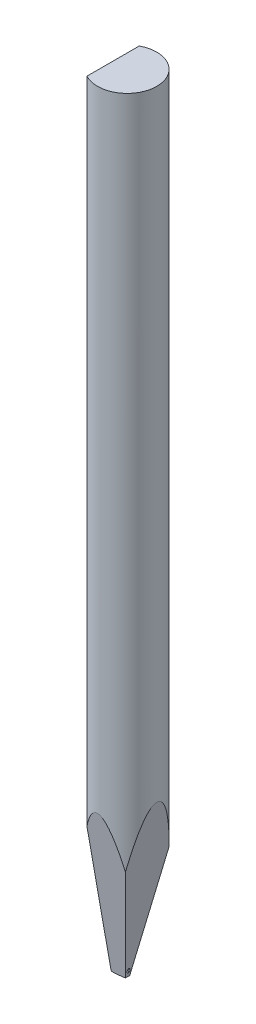
ISO-10303-21;
HEADER;
FILE_DESCRIPTION(('STEP AP214'),'2;1');
FILE_NAME('part.step','',(''),(''),'','','');
FILE_SCHEMA(('AUTOMOTIVE_DESIGN { 1 0 10303 214 1 1 1 1 }'));
ENDSEC;
DATA;
#1=APPLICATION_CONTEXT('core data for automotive mechanical design processes');
#2=APPLICATION_PROTOCOL_DEFINITION('international standard','automotive_design',2000,#1);
#3=PRODUCT_CONTEXT('',#1,'mechanical');
#4=PRODUCT('Part','Part','',(#3));
#5=PRODUCT_RELATED_PRODUCT_CATEGORY('part','',(#4));
#6=PRODUCT_DEFINITION_FORMATION('','',#4);
#7=PRODUCT_DEFINITION_CONTEXT('part definition',#1,'design');
#8=PRODUCT_DEFINITION('design','',#6,#7);
#9=PRODUCT_DEFINITION_SHAPE('','',#8);
#10=(LENGTH_UNIT() NAMED_UNIT(*) SI_UNIT(.MILLI.,.METRE.));
#11=(NAMED_UNIT(*) PLANE_ANGLE_UNIT() SI_UNIT($,.RADIAN.));
#12=(NAMED_UNIT(*) SI_UNIT($,.STERADIAN.) SOLID_ANGLE_UNIT());
#13=UNCERTAINTY_MEASURE_WITH_UNIT(LENGTH_MEASURE(1.E-05),#10,'distance_accuracy_value','');
#14=(GEOMETRIC_REPRESENTATION_CONTEXT(3) GLOBAL_UNCERTAINTY_ASSIGNED_CONTEXT((#13)) GLOBAL_UNIT_ASSIGNED_CONTEXT((#10,
#11,#12)) REPRESENTATION_CONTEXT('',''));
#15=CARTESIAN_POINT('',(0.,0.,0.));
#16=DIRECTION('',(0.,0.,1.));
#17=DIRECTION('',(1.,0.,0.));
#18=AXIS2_PLACEMENT_3D('',#15,#16,#17);
#19=CARTESIAN_POINT('',(26.8738719491216,0.,0.0508));
#20=DIRECTION('',(0.,-0.173648177666931,0.984807753012208));
#21=DIRECTION('',(0.,-0.984807753012208,-0.173648177666931));
#22=AXIS2_PLACEMENT_3D('',#19,#20,#21);
#23=PLANE('',#22);
#24=CARTESIAN_POINT('',(-0.35052,0.0254,0.0552787053099968));
#25=DIRECTION('',(0.,-0.173648177666931,0.984807753012208));
#26=DIRECTION('',(0.,-0.984807753012208,-0.173648177666931));
#27=AXIS2_PLACEMENT_3D('',#24,#25,#26);
#28=ELLIPSE('',#27,0.0257918359418979,0.0254);
#29=CARTESIAN_POINT('',(-0.35052,0.,0.0508000000000018));
#30=VERTEX_POINT('',#29);
#31=CARTESIAN_POINT('',(-0.37592,0.0254,0.0552787053099968));
#32=VERTEX_POINT('',#31);
#33=EDGE_CURVE('E198',#30,#32,#28,.F.);
#34=ORIENTED_EDGE('',*,*,#33,.F.);
#35=DIRECTION('',(-1.,0.,0.));
#36=VECTOR('',#35,1.);
#37=CARTESIAN_POINT('',(26.8738719491216,0.,0.0508));
#38=LINE('',#37,#36);
#39=CARTESIAN_POINT('',(-0.248920000000001,0.,0.0508000000000001));
#40=VERTEX_POINT('',#39);
#41=EDGE_CURVE('E258',#40,#30,#38,.T.);
#42=ORIENTED_EDGE('',*,*,#41,.F.);
#43=DIRECTION('',(-0.98997002855162,-0.139131214142995,-0.0245325869121374));
#44=VECTOR('',#43,1.);
#45=CARTESIAN_POINT('',(26.3325188531676,3.73577760401477,0.709518385514232));
#46=LINE('',#45,#44);
#47=CARTESIAN_POINT('',(0.0115343561363234,0.0366044726132731,0.0572543561363242));
#48=VERTEX_POINT('',#47);
#49=EDGE_CURVE('E255',#48,#40,#46,.T.);
#50=ORIENTED_EDGE('',*,*,#49,.F.);
#51=DIRECTION('',(-0.171087869746036,-0.970287525247814,-0.171087869746036));
#52=VECTOR('',#51,1.);
#53=CARTESIAN_POINT('',(0.791557999082988,4.46033837772866,0.837277999082991));
#54=LINE('',#53,#52);
#55=CARTESIAN_POINT('',(0.537041505266772,3.01690361355591,0.582761505266774));
#56=VERTEX_POINT('',#55);
#57=EDGE_CURVE('E252',#56,#48,#54,.T.);
#58=ORIENTED_EDGE('',*,*,#57,.F.);
#59=CARTESIAN_POINT('',(0.,-0.288101116436578,0.));
#60=DIRECTION('',(0.,-0.173648177666931,0.984807753012208));
#61=DIRECTION('',(0.,-0.984807753012208,-0.173648177666931));
#62=AXIS2_PLACEMENT_3D('',#59,#60,#61);
#63=ELLIPSE('',#62,4.56371043248163,0.792479999999998);
#64=CARTESIAN_POINT('',(-0.37592,3.66844093071415,0.69764511322018));
#65=VERTEX_POINT('',#64);
#66=EDGE_CURVE('E263',#56,#65,#63,.T.);
#67=ORIENTED_EDGE('',*,*,#66,.T.);
#68=DIRECTION('',(0.,0.984807753012208,0.173648177666931));
#69=VECTOR('',#68,1.);
#70=CARTESIAN_POINT('',(-0.37592,20.251112252608,3.62161747949059));
#71=LINE('',#70,#69);
#72=EDGE_CURVE('E277',#32,#65,#71,.T.);
#73=ORIENTED_EDGE('',*,*,#72,.F.);
#74=EDGE_LOOP('',(#34,#42,#50,#58,#67,#73));
#75=FACE_BOUND('',#74,.T.);
#76=ADVANCED_FACE('F46',(#75),#23,.T.);
#77=CARTESIAN_POINT('',(26.8738719491216,0.,-0.0508));
#78=DIRECTION('',(0.,-0.173648177666931,-0.984807753012208));
#79=DIRECTION('',(0.,0.984807753012208,-0.173648177666931));
#80=AXIS2_PLACEMENT_3D('',#77,#78,#79);
#81=PLANE('',#80);
#82=CARTESIAN_POINT('',(-0.35052,0.0254,-0.0552787053099968));
#83=DIRECTION('',(0.,-0.173648177666931,-0.984807753012208));
#84=DIRECTION('',(0.,0.984807753012208,-0.173648177666931));
#85=AXIS2_PLACEMENT_3D('',#82,#83,#84);
#86=ELLIPSE('',#85,0.0257918359418979,0.0254);
#87=CARTESIAN_POINT('',(-0.37592,0.0254,-0.0552787053099968));
#88=VERTEX_POINT('',#87);
#89=CARTESIAN_POINT('',(-0.35052,0.,-0.0508000000000018));
#90=VERTEX_POINT('',#89);
#91=EDGE_CURVE('E195',#88,#90,#86,.F.);
#92=ORIENTED_EDGE('',*,*,#91,.F.);
#93=DIRECTION('',(0.,-0.984807753012208,0.173648177666931));
#94=VECTOR('',#93,1.);
#95=CARTESIAN_POINT('',(-0.37592,20.5255765703836,-3.67001294395617));
#96=LINE('',#95,#94);
#97=CARTESIAN_POINT('',(-0.37592,3.66844093071414,-0.69764511322018));
#98=VERTEX_POINT('',#97);
#99=EDGE_CURVE('E187',#98,#88,#96,.T.);
#100=ORIENTED_EDGE('',*,*,#99,.F.);
#101=CARTESIAN_POINT('',(0.,-0.288101116436578,0.));
#102=DIRECTION('',(0.,-0.173648177666931,-0.984807753012208));
#103=DIRECTION('',(0.,-0.984807753012208,0.173648177666931));
#104=AXIS2_PLACEMENT_3D('',#101,#102,#103);
#105=ELLIPSE('',#104,4.56371043248163,0.792479999999998);
#106=CARTESIAN_POINT('',(0.537041505266772,3.01690361355591,-0.582761505266774));
#107=VERTEX_POINT('',#106);
#108=EDGE_CURVE('E266',#98,#107,#105,.T.);
#109=ORIENTED_EDGE('',*,*,#108,.T.);
#110=DIRECTION('',(0.171087869746036,0.970287525247814,-0.171087869746036));
#111=VECTOR('',#110,1.);
#112=CARTESIAN_POINT('',(0.791557999082988,4.46033837772866,-0.837277999082991));
#113=LINE('',#112,#111);
#114=CARTESIAN_POINT('',(0.0115343561363234,0.0366044726132731,-0.0572543561363242));
#115=VERTEX_POINT('',#114);
#116=EDGE_CURVE('E280',#115,#107,#113,.T.);
#117=ORIENTED_EDGE('',*,*,#116,.F.);
#118=DIRECTION('',(0.98997002855162,0.139131214142995,-0.0245325869121374));
#119=VECTOR('',#118,1.);
#120=CARTESIAN_POINT('',(26.3325188531676,3.73577760401477,-0.709518385514232));
#121=LINE('',#120,#119);
#122=CARTESIAN_POINT('',(-0.248920000000001,0.,-0.0508000000000001));
#123=VERTEX_POINT('',#122);
#124=EDGE_CURVE('E283',#123,#115,#121,.T.);
#125=ORIENTED_EDGE('',*,*,#124,.F.);
#126=DIRECTION('',(-1.,0.,0.));
#127=VECTOR('',#126,1.);
#128=CARTESIAN_POINT('',(26.8738719491216,0.,-0.0508));
#129=LINE('',#128,#127);
#130=EDGE_CURVE('E260',#123,#90,#129,.T.);
#131=ORIENTED_EDGE('',*,*,#130,.T.);
#132=EDGE_LOOP('',(#92,#100,#109,#117,#125,#131));
#133=FACE_BOUND('',#132,.T.);
#134=ADVANCED_FACE('F372',(#133),#81,.T.);
#135=CARTESIAN_POINT('',(-0.24892,0.,27.2760283406468));
#136=DIRECTION('',(-0.139173100960066,0.99026806874157,0.));
#137=DIRECTION('',(-0.99026806874157,-0.139173100960066,0.));
#138=AXIS2_PLACEMENT_3D('',#135,#136,#137);
#139=PLANE('',#138);
#140=DIRECTION('',(-0.99026806874157,-0.139173100960066,0.));
#141=VECTOR('',#140,1.);
#142=CARTESIAN_POINT('',(-0.24892,0.,0.0253999999999983));
#143=LINE('',#142,#141);
#144=CARTESIAN_POINT('',(-0.127,0.0171347385669156,0.0253999999999992));
#145=VERTEX_POINT('',#144);
#146=CARTESIAN_POINT('',(-0.229291435266472,0.00275861487165988,0.0254));
#147=VERTEX_POINT('',#146);
#148=EDGE_CURVE('E238',#145,#147,#143,.T.);
#149=ORIENTED_EDGE('',*,*,#148,.F.);
#150=DIRECTION('',(0.,0.,1.));
#151=VECTOR('',#150,1.);
#152=CARTESIAN_POINT('',(-0.127,0.0171347385669156,27.2760283406468));
#153=LINE('',#152,#151);
#154=CARTESIAN_POINT('',(-0.127,0.0171347385669156,-0.0253999999999992));
#155=VERTEX_POINT('',#154);
#156=EDGE_CURVE('E294',#155,#145,#153,.T.);
#157=ORIENTED_EDGE('',*,*,#156,.F.);
#158=DIRECTION('',(-0.99026806874157,-0.139173100960066,0.));
#159=VECTOR('',#158,1.);
#160=CARTESIAN_POINT('',(-0.24892,0.,-0.0253999999999983));
#161=LINE('',#160,#159);
#162=CARTESIAN_POINT('',(-0.229291435266472,0.00275861487165988,-0.0254));
#163=VERTEX_POINT('',#162);
#164=EDGE_CURVE('E234',#155,#163,#161,.T.);
#165=ORIENTED_EDGE('',*,*,#164,.T.);
#166=CARTESIAN_POINT('',(-2.40864817183527,-0.30353,0.));
#167=DIRECTION('',(-0.139173100960066,0.99026806874157,0.));
#168=DIRECTION('',(-0.99026806874157,-0.139173100960066,0.));
#169=AXIS2_PLACEMENT_3D('',#166,#167,#168);
#170=ELLIPSE('',#169,2.20832903686027,0.30734);
#171=CARTESIAN_POINT('',(-0.24892,0.,-0.0482432865795794));
#172=VERTEX_POINT('',#171);
#173=EDGE_CURVE('E286',#163,#172,#170,.T.);
#174=ORIENTED_EDGE('',*,*,#173,.T.);
#175=DIRECTION('',(0.,0.,-1.));
#176=VECTOR('',#175,1.);
#177=CARTESIAN_POINT('',(-0.24892,0.,27.2760283406468));
#178=LINE('',#177,#176);
#179=EDGE_CURVE('E244',#172,#123,#178,.T.);
#180=ORIENTED_EDGE('',*,*,#179,.T.);
#181=ORIENTED_EDGE('',*,*,#124,.T.);
#182=DIRECTION('',(0.,0.,-1.));
#183=VECTOR('',#182,1.);
#184=CARTESIAN_POINT('',(0.0115343561363241,0.036604472613273,27.2760283406468));
#185=LINE('',#184,#183);
#186=EDGE_CURVE('E241',#48,#115,#185,.T.);
#187=ORIENTED_EDGE('',*,*,#186,.F.);
#188=ORIENTED_EDGE('',*,*,#49,.T.);
#189=CARTESIAN_POINT('',(-0.24892,0.,0.0482432865795852));
#190=VERTEX_POINT('',#189);
#191=EDGE_CURVE('E246',#40,#190,#178,.T.);
#192=ORIENTED_EDGE('',*,*,#191,.T.);
#193=EDGE_CURVE('E287',#190,#147,#170,.T.);
#194=ORIENTED_EDGE('',*,*,#193,.T.);
#195=EDGE_LOOP('',(#149,#157,#165,#174,#180,#181,#187,#188,#192,#194));
#196=FACE_BOUND('',#195,.T.);
#197=ADVANCED_FACE('F319',(#196),#139,.F.);
#198=CARTESIAN_POINT('',(26.7151219491216,-0.30353,0.));
#199=DIRECTION('',(-1.,0.,0.));
#200=DIRECTION('',(0.,0.,1.));
#201=AXIS2_PLACEMENT_3D('',#198,#199,#200);
#202=CYLINDRICAL_SURFACE('',#201,0.30734);
#203=DIRECTION('',(-1.,0.,0.));
#204=VECTOR('',#203,1.);
#205=CARTESIAN_POINT('',(26.7151219491216,0.,0.0482432865795852));
#206=LINE('',#205,#204);
#207=CARTESIAN_POINT('',(-0.35052,0.,0.0482432865795858));
#208=VERTEX_POINT('',#207);
#209=EDGE_CURVE('E293',#190,#208,#206,.T.);
#210=ORIENTED_EDGE('',*,*,#209,.T.);
#211=CARTESIAN_POINT('',(-0.35052,0.,0.0482432865795852));
#212=CARTESIAN_POINT('',(-0.350767913301096,-1.19542843772803E-07,0.0482439866555444));
#213=CARTESIAN_POINT('',(-0.351014861392933,3.62470794984307E-06,0.0482204837583812));
#214=CARTESIAN_POINT('',(-0.351497824475882,1.77257610530701E-05,0.048131663550789));
#215=CARTESIAN_POINT('',(-0.351733938449228,2.79980345508259E-05,0.0480668807295799));
#216=CARTESIAN_POINT('',(-0.352256326088675,5.77005969758154E-05,0.0478789541586123));
#217=CARTESIAN_POINT('',(-0.352538394385228,7.88787351782238E-05,0.0477446199469163));
#218=CARTESIAN_POINT('',(-0.353078295346921,0.000127703558985932,0.0474331108524059));
#219=CARTESIAN_POINT('',(-0.353335984553503,0.000155385552449527,0.0472557019452807));
#220=CARTESIAN_POINT('',(-0.35400174233734,0.00023617459435752,0.0467343071530912));
#221=CARTESIAN_POINT('',(-0.354386489991853,0.000293366747035686,0.04636155839518));
#222=CARTESIAN_POINT('',(-0.355098951579075,0.000413574680164901,0.0455669319559007));
#223=CARTESIAN_POINT('',(-0.355426537167256,0.000476603091413842,0.0451449471799639));
#224=CARTESIAN_POINT('',(-0.356612086855196,0.000724574718518854,0.0434579803018295));
#225=CARTESIAN_POINT('',(-0.357318341338528,0.000917424822642028,0.0420900984298448));
#226=CARTESIAN_POINT('',(-0.358546499103955,0.00129385703696121,0.0392733364497388));
#227=CARTESIAN_POINT('',(-0.359067131306756,0.0014773681362723,0.0378239736931028));
#228=CARTESIAN_POINT('',(-0.361082963556255,0.00223677886764504,0.0314441024489423));
#229=CARTESIAN_POINT('',(-0.361998491462294,0.00272303861932352,0.0263250556700738));
#230=CARTESIAN_POINT('',(-0.363287466260708,0.00343648568054079,0.0160225561821279));
#231=CARTESIAN_POINT('',(-0.363659578270333,0.0036630347273081,0.0108389763129056));
#232=CARTESIAN_POINT('',(-0.363972985043323,0.00385330138614358,0.000449493392470492));
#233=CARTESIAN_POINT('',(-0.363914353724792,0.00381706409391508,-0.00475640567539981));
#234=CARTESIAN_POINT('',(-0.363359645903479,0.00348101396992523,-0.0151346555748545));
#235=CARTESIAN_POINT('',(-0.362863906204434,0.00318140407436096,-0.0203070291482792));
#236=CARTESIAN_POINT('',(-0.361587863461915,0.00253284401461739,-0.0281196828661227));
#237=CARTESIAN_POINT('',(-0.361052170464876,0.0022738659867185,-0.0308032472057407));
#238=CARTESIAN_POINT('',(-0.359879874536839,0.00178202258087802,-0.0352985409759539));
#239=CARTESIAN_POINT('',(-0.359320212463211,0.00156415994286779,-0.0371329765625637));
#240=CARTESIAN_POINT('',(-0.357915449615104,0.00108653420359569,-0.0408693960879428));
#241=CARTESIAN_POINT('',(-0.3570519058511,0.000824845821217691,-0.0427659366927652));
#242=CARTESIAN_POINT('',(-0.355666955135482,0.000526022910364276,-0.0448100132221557));
#243=CARTESIAN_POINT('',(-0.355427139387419,0.000477218188454204,-0.0451397061499097));
#244=CARTESIAN_POINT('',(-0.354916645564511,0.00038202095342617,-0.0457761949331125));
#245=CARTESIAN_POINT('',(-0.354645904201855,0.000335633680386315,-0.046082941629228));
#246=CARTESIAN_POINT('',(-0.354064289185953,0.000246758191854156,-0.046665244521223));
#247=CARTESIAN_POINT('',(-0.353752942125983,0.000204328109509145,-0.0469403464238046));
#248=CARTESIAN_POINT('',(-0.353086480397482,0.000127793869631165,-0.0474329155161114));
#249=CARTESIAN_POINT('',(-0.352731561443898,9.36543940562352E-05,-0.0476506275388426));
#250=CARTESIAN_POINT('',(-0.352132978988963,5.02841505678784E-05,-0.0479259603811109));
#251=CARTESIAN_POINT('',(-0.351903112512649,3.65754200289388E-05,-0.0480126464944021));
#252=CARTESIAN_POINT('',(-0.351432234922708,1.53075235908591E-05,-0.0481469291864184));
#253=CARTESIAN_POINT('',(-0.351191258260106,7.73054276230474E-06,-0.0481946390090931));
#254=CARTESIAN_POINT('',(-0.350805892270728,1.19685939597785E-06,-0.0482357533750439));
#255=CARTESIAN_POINT('',(-0.350662956582406,-3.31045745205668E-08,-0.0482434827775498));
#256=CARTESIAN_POINT('',(-0.35052,0.,-0.0482432865795856));
#257=B_SPLINE_CURVE_WITH_KNOTS('',3,(#211,#212,#213,#214,#215,#216,#217,#218,#219,#220,#221,
#222,#223,#224,#225,#226,#227,#228,#229,#230,#231,#232,#233,#234,#235,#236,#237,#238,#239,#240,
#241,#242,#243,#244,#245,#246,#247,#248,#249,#250,#251,#252,#253,#254,#255,#256),.UNSPECIFIED.,
.F.,.F.,(4,2,2,2,2,2,2,2,2,2,2,2,2,2,2,2,2,2,2,2,2,2,4),(0.,0.000741043318305486,
0.00147268140779397,0.00240682725086805,0.00334616655924916,0.00495326023235424,
0.00656391709747215,0.0111818210055972,0.0158307654682357,0.0313880221471822,0.0469834307890158,
0.0625761632290354,0.0781568915394422,0.0863865542979192,0.0921775559520869,0.0984081610414817,
0.0996385359491797,0.100871475463076,0.102120347956776,0.103363803055068,0.104099176293444,
0.104832405260387,0.105261095012052),.UNSPECIFIED.);
#258=CARTESIAN_POINT('',(-0.361394986445844,0.00245148621527606,0.0288612599442366));
#259=VERTEX_POINT('',#258);
#260=EDGE_CURVE('E196',#208,#259,#257,.T.);
#261=ORIENTED_EDGE('',*,*,#260,.T.);
#262=CARTESIAN_POINT('',(-0.37592,0.,-0.0482432865795854));
#263=CARTESIAN_POINT('',(-0.363217772431748,0.00253447256157342,-0.0322972656685655));
#264=CARTESIAN_POINT('',(-0.35052,0.00380999999999999,-0.0161478491107738));
#265=CARTESIAN_POINT('',(-0.35052,0.00380999999999997,0.0161478491107741));
#266=CARTESIAN_POINT('',(-0.363217772431748,0.00253447256157349,0.0322972656685651));
#267=CARTESIAN_POINT('',(-0.37592,0.,0.0482432865795852));
#268=(BOUNDED_CURVE() B_SPLINE_CURVE(3,(#262,#263,#264,#265,#266,#267),.UNSPECIFIED.,.F.,
.F.) B_SPLINE_CURVE_WITH_KNOTS((4,2,4),(1.41317404265068,1.5707963267949,1.72841861093912),
.UNSPECIFIED.) CURVE() GEOMETRIC_REPRESENTATION_ITEM() RATIONAL_B_SPLINE_CURVE((1.,1.,1.,1.,1.,1.)) REPRESENTATION_ITEM(''));
#269=CARTESIAN_POINT('',(-0.361394935619562,0.00245148328491546,-0.0288612910505786));
#270=VERTEX_POINT('',#269);
#271=EDGE_CURVE('E179',#259,#270,#268,.F.);
#272=ORIENTED_EDGE('',*,*,#271,.T.);
#273=CARTESIAN_POINT('',(-0.35052,0.,-0.0482432865795858));
#274=VERTEX_POINT('',#273);
#275=EDGE_CURVE('E79',#270,#274,#257,.T.);
#276=ORIENTED_EDGE('',*,*,#275,.T.);
#277=DIRECTION('',(-1.,0.,0.));
#278=VECTOR('',#277,1.);
#279=CARTESIAN_POINT('',(26.7151219491216,0.,-0.0482432865795852));
#280=LINE('',#279,#278);
#281=EDGE_CURVE('E245',#172,#274,#280,.T.);
#282=ORIENTED_EDGE('',*,*,#281,.F.);
#283=ORIENTED_EDGE('',*,*,#173,.F.);
#284=DIRECTION('',(-1.,0.,0.));
#285=VECTOR('',#284,1.);
#286=CARTESIAN_POINT('',(26.7151219491216,0.00275861487165988,-0.0254));
#287=LINE('',#286,#285);
#288=CARTESIAN_POINT('',(-0.263296988873618,0.00275861487165998,-0.0254));
#289=VERTEX_POINT('',#288);
#290=EDGE_CURVE('E290',#163,#289,#287,.T.);
#291=ORIENTED_EDGE('',*,*,#290,.T.);
#292=CARTESIAN_POINT('',(-0.263296988875004,0.00275861487165987,0.0254));
#293=CARTESIAN_POINT('',(-0.270734027278252,0.00227839014138407,0.0311908412387123));
#294=CARTESIAN_POINT('',(-0.281399317061494,0.00222051182107874,0.0315772334155203));
#295=CARTESIAN_POINT('',(-0.299637517659056,0.00305120667026088,0.0221011507762897));
#296=CARTESIAN_POINT('',(-0.307014429433515,0.00381514375293365,0.0112874623383318));
#297=CARTESIAN_POINT('',(-0.306930926035332,0.00380479320255615,-0.0115658584503158));
#298=CARTESIAN_POINT('',(-0.299558764068592,0.00304188070678955,-0.0222274322645247));
#299=CARTESIAN_POINT('',(-0.281227803414871,0.00220989503176079,-0.0316779634941937));
#300=CARTESIAN_POINT('',(-0.270691626074725,0.00228026583559311,-0.0311682229796096));
#301=CARTESIAN_POINT('',(-0.263296988873618,0.00275861487165988,-0.0254));
#302=(BOUNDED_CURVE() B_SPLINE_CURVE(3,(#292,#293,#294,#295,#296,#297,#298,#299,#300,#301),
.UNSPECIFIED.,.F.,.F.) B_SPLINE_CURVE_WITH_KNOTS((4,2,2,2,4),(0.,2.20521884168098E-05,
4.41043768336191E-05,6.61565652504285E-05,8.82087536672378E-05),
.UNSPECIFIED.) CURVE() GEOMETRIC_REPRESENTATION_ITEM() RATIONAL_B_SPLINE_CURVE((1.,1.,1.,1.,1.,
1.,1.,1.,1.,1.)) REPRESENTATION_ITEM(''));
#303=CARTESIAN_POINT('',(-0.263296988873618,0.00275861487166091,0.0254));
#304=VERTEX_POINT('',#303);
#305=EDGE_CURVE('E296',#289,#304,#302,.F.);
#306=ORIENTED_EDGE('',*,*,#305,.T.);
#307=DIRECTION('',(-1.,0.,0.));
#308=VECTOR('',#307,1.);
#309=CARTESIAN_POINT('',(26.7151219491216,0.00275861487165988,0.0254));
#310=LINE('',#309,#308);
#311=EDGE_CURVE('E297',#147,#304,#310,.T.);
#312=ORIENTED_EDGE('',*,*,#311,.F.);
#313=ORIENTED_EDGE('',*,*,#193,.F.);
#314=EDGE_LOOP('',(#210,#261,#272,#276,#282,#283,#291,#306,#312,#313));
#315=FACE_BOUND('',#314,.T.);
#316=ADVANCED_FACE('F308',(#315),#202,.F.);
#317=CARTESIAN_POINT('',(0.,0.,0.));
#318=DIRECTION('',(0.,1.,0.));
#319=DIRECTION('',(0.,0.,1.));
#320=AXIS2_PLACEMENT_3D('',#317,#318,#319);
#321=PLANE('',#320);
#322=ORIENTED_EDGE('',*,*,#41,.T.);
#323=DIRECTION('',(0.,0.,-1.));
#324=VECTOR('',#323,1.);
#325=CARTESIAN_POINT('',(-0.35052,0.,26.4439971138647));
#326=LINE('',#325,#324);
#327=EDGE_CURVE('E71',#30,#208,#326,.T.);
#328=ORIENTED_EDGE('',*,*,#327,.T.);
#329=ORIENTED_EDGE('',*,*,#209,.F.);
#330=ORIENTED_EDGE('',*,*,#191,.F.);
#331=EDGE_LOOP('',(#322,#328,#329,#330));
#332=FACE_BOUND('',#331,.T.);
#333=ADVANCED_FACE('F318',(#332),#321,.F.);
#334=ORIENTED_EDGE('',*,*,#281,.T.);
#335=EDGE_CURVE('E194',#274,#90,#326,.T.);
#336=ORIENTED_EDGE('',*,*,#335,.T.);
#337=ORIENTED_EDGE('',*,*,#130,.F.);
#338=ORIENTED_EDGE('',*,*,#179,.F.);
#339=EDGE_LOOP('',(#334,#336,#337,#338));
#340=FACE_BOUND('',#339,.T.);
#341=ADVANCED_FACE('F377',(#340),#321,.F.);
#342=CARTESIAN_POINT('',(0.,21.0312,0.));
#343=DIRECTION('',(0.,-1.,0.));
#344=DIRECTION('',(0.,0.,-1.));
#345=AXIS2_PLACEMENT_3D('',#342,#343,#344);
#346=CYLINDRICAL_SURFACE('',#345,0.792479999999998);
#347=ORIENTED_EDGE('',*,*,#66,.F.);
#348=CARTESIAN_POINT('',(0.,-0.0288101116436568,0.));
#349=DIRECTION('',(-0.984807753012208,0.173648177666931,0.));
#350=DIRECTION('',(-0.173648177666931,-0.984807753012208,0.));
#351=AXIS2_PLACEMENT_3D('',#348,#349,#350);
#352=ELLIPSE('',#351,4.56371043248164,0.792479999999998);
#353=EDGE_CURVE('E249',#56,#107,#352,.T.);
#354=ORIENTED_EDGE('',*,*,#353,.T.);
#355=ORIENTED_EDGE('',*,*,#108,.F.);
#356=DIRECTION('',(0.,-1.,0.));
#357=VECTOR('',#356,1.);
#358=CARTESIAN_POINT('',(-0.37592,21.0312,-0.69764511322018));
#359=LINE('',#358,#357);
#360=CARTESIAN_POINT('',(-0.37592,21.0312,-0.69764511322018));
#361=VERTEX_POINT('',#360);
#362=EDGE_CURVE('E272',#361,#98,#359,.T.);
#363=ORIENTED_EDGE('',*,*,#362,.F.);
#364=CARTESIAN_POINT('',(0.,21.0312,0.));
#365=DIRECTION('',(0.,1.,0.));
#366=DIRECTION('',(0.,0.,1.));
#367=AXIS2_PLACEMENT_3D('',#364,#365,#366);
#368=CIRCLE('',#367,0.792479999999998);
#369=CARTESIAN_POINT('',(-0.37592,21.0312,0.69764511322018));
#370=VERTEX_POINT('',#369);
#371=EDGE_CURVE('E274',#370,#361,#368,.T.);
#372=ORIENTED_EDGE('',*,*,#371,.F.);
#373=DIRECTION('',(0.,-1.,0.));
#374=VECTOR('',#373,1.);
#375=CARTESIAN_POINT('',(-0.37592,21.0312,0.69764511322018));
#376=LINE('',#375,#374);
#377=EDGE_CURVE('E270',#65,#370,#376,.F.);
#378=ORIENTED_EDGE('',*,*,#377,.F.);
#379=EDGE_LOOP('',(#347,#354,#355,#363,#372,#378));
#380=FACE_BOUND('',#379,.T.);
#381=ADVANCED_FACE('F371',(#380),#346,.T.);
#382=CARTESIAN_POINT('',(-0.37592,21.0312,-0.80247998));
#383=DIRECTION('',(-1.,0.,0.));
#384=DIRECTION('',(0.,0.,1.));
#385=AXIS2_PLACEMENT_3D('',#382,#383,#384);
#386=PLANE('',#385);
#387=DIRECTION('',(0.,0.,-1.));
#388=VECTOR('',#387,1.);
#389=CARTESIAN_POINT('',(-0.37592,0.0254,26.4439971138647));
#390=LINE('',#389,#388);
#391=CARTESIAN_POINT('',(-0.37592,0.0253965728299479,0.0162828578856257));
#392=VERTEX_POINT('',#391);
#393=EDGE_CURVE('E190',#32,#392,#390,.T.);
#394=ORIENTED_EDGE('',*,*,#393,.F.);
#395=ORIENTED_EDGE('',*,*,#72,.T.);
#396=ORIENTED_EDGE('',*,*,#377,.T.);
#397=DIRECTION('',(0.,0.,-1.));
#398=VECTOR('',#397,1.);
#399=CARTESIAN_POINT('',(-0.37592,21.0312,-0.80247998));
#400=LINE('',#399,#398);
#401=EDGE_CURVE('E268',#370,#361,#400,.T.);
#402=ORIENTED_EDGE('',*,*,#401,.T.);
#403=ORIENTED_EDGE('',*,*,#362,.T.);
#404=ORIENTED_EDGE('',*,*,#99,.T.);
#405=CARTESIAN_POINT('',(-0.37592,0.0254,-0.0160570095759892));
#406=VERTEX_POINT('',#405);
#407=EDGE_CURVE('E184',#406,#88,#390,.T.);
#408=ORIENTED_EDGE('',*,*,#407,.F.);
#409=CARTESIAN_POINT('',(-0.37592,0.,0.0482432865795852));
#410=CARTESIAN_POINT('',(-0.37592,0.0149574693246277,0.0344039161936227));
#411=CARTESIAN_POINT('',(-0.37592,0.0292099999999983,0.0174815349681417));
#412=CARTESIAN_POINT('',(-0.37592,0.0292099999999983,-0.0174815349681413));
#413=CARTESIAN_POINT('',(-0.37592,0.0149574693246281,-0.0344039161936234));
#414=CARTESIAN_POINT('',(-0.37592,0.,-0.0482432865795854));
#415=(BOUNDED_CURVE() B_SPLINE_CURVE(3,(#409,#410,#411,#412,#413,#414),.UNSPECIFIED.,.F.,
.F.) B_SPLINE_CURVE_WITH_KNOTS((4,2,4),(1.41317404265068,1.5707963267949,1.72841861093912),
.UNSPECIFIED.) CURVE() GEOMETRIC_REPRESENTATION_ITEM() RATIONAL_B_SPLINE_CURVE((1.,1.,1.,1.,1.,1.)) REPRESENTATION_ITEM(''));
#416=EDGE_CURVE('E172',#406,#392,#415,.F.);
#417=ORIENTED_EDGE('',*,*,#416,.T.);
#418=EDGE_LOOP('',(#394,#395,#396,#402,#403,#404,#408,#417));
#419=FACE_BOUND('',#418,.T.);
#420=ADVANCED_FACE('F185',(#419),#386,.T.);
#421=CARTESIAN_POINT('',(0.,21.0312,0.));
#422=DIRECTION('',(0.,1.,0.));
#423=DIRECTION('',(0.,0.,1.));
#424=AXIS2_PLACEMENT_3D('',#421,#422,#423);
#425=PLANE('',#424);
#426=ORIENTED_EDGE('',*,*,#371,.T.);
#427=ORIENTED_EDGE('',*,*,#401,.F.);
#428=EDGE_LOOP('',(#426,#427));
#429=FACE_BOUND('',#428,.T.);
#430=ADVANCED_FACE('F370',(#429),#425,.T.);
#431=CARTESIAN_POINT('',(0.0115343561363241,0.036604472613273,27.2760283406468));
#432=DIRECTION('',(-0.984807753012208,0.173648177666931,0.));
#433=DIRECTION('',(-0.173648177666931,-0.984807753012208,0.));
#434=AXIS2_PLACEMENT_3D('',#431,#432,#433);
#435=PLANE('',#434);
#436=CARTESIAN_POINT('',(0.0384284330254712,0.189128361930093,0.));
#437=DIRECTION('',(-0.984807753012208,0.173648177666931,0.));
#438=DIRECTION('',(0.173648177666931,0.984807753012208,0.));
#439=AXIS2_PLACEMENT_3D('',#436,#437,#438);
#440=ELLIPSE('',#439,0.0566555398592855,0.04069486264531);
#441=CARTESIAN_POINT('',(0.0482665642767722,0.24492317683461,0.));
#442=VERTEX_POINT('',#441);
#443=EDGE_CURVE('E240',#442,#442,#440,.F.);
#444=ORIENTED_EDGE('',*,*,#443,.F.);
#445=EDGE_LOOP('',(#444));
#446=FACE_BOUND('',#445,.T.);
#447=ORIENTED_EDGE('',*,*,#353,.F.);
#448=ORIENTED_EDGE('',*,*,#57,.T.);
#449=ORIENTED_EDGE('',*,*,#186,.T.);
#450=ORIENTED_EDGE('',*,*,#116,.T.);
#451=EDGE_LOOP('',(#447,#448,#449,#450));
#452=FACE_BOUND('',#451,.T.);
#453=ADVANCED_FACE('F324',(#446,#452),#435,.F.);
#454=CARTESIAN_POINT('',(-0.127,0.0762000000000001,0.0254));
#455=DIRECTION('',(-1.,0.,0.));
#456=DIRECTION('',(0.,0.,1.));
#457=AXIS2_PLACEMENT_3D('',#454,#455,#456);
#458=PLANE('',#457);
#459=ORIENTED_EDGE('',*,*,#156,.T.);
#460=DIRECTION('',(0.,1.,0.));
#461=VECTOR('',#460,1.);
#462=CARTESIAN_POINT('',(-0.127,0.0762000000000001,0.0254));
#463=LINE('',#462,#461);
#464=CARTESIAN_POINT('',(-0.127,0.0762000000000001,0.0254));
#465=VERTEX_POINT('',#464);
#466=EDGE_CURVE('E225',#145,#465,#463,.T.);
#467=ORIENTED_EDGE('',*,*,#466,.T.);
#468=CARTESIAN_POINT('',(-0.127,0.0762000000000001,0.));
#469=DIRECTION('',(1.,0.,0.));
#470=DIRECTION('',(0.,1.,0.));
#471=AXIS2_PLACEMENT_3D('',#468,#469,#470);
#472=ELLIPSE('',#471,0.0293293936748329,0.0254);
#473=CARTESIAN_POINT('',(-0.127,0.0762000000000001,-0.0253999999999983));
#474=VERTEX_POINT('',#473);
#475=EDGE_CURVE('E218',#474,#465,#472,.F.);
#476=ORIENTED_EDGE('',*,*,#475,.F.);
#477=DIRECTION('',(0.,1.,0.));
#478=VECTOR('',#477,1.);
#479=CARTESIAN_POINT('',(-0.127,0.0762000000000001,-0.0254));
#480=LINE('',#479,#478);
#481=EDGE_CURVE('E226',#155,#474,#480,.T.);
#482=ORIENTED_EDGE('',*,*,#481,.F.);
#483=EDGE_LOOP('',(#459,#467,#476,#482));
#484=FACE_BOUND('',#483,.T.);
#485=ADVANCED_FACE('F483',(#484),#458,.T.);
#486=CARTESIAN_POINT('',(0.00833549193050168,0.154335982696985,0.));
#487=DIRECTION('',(0.866025403784441,0.499999999999995,0.));
#488=DIRECTION('',(-0.499999999999995,0.866025403784441,0.));
#489=AXIS2_PLACEMENT_3D('',#486,#487,#488);
#490=CONICAL_SURFACE('',#489,0.0254,0.392699081698725);
#491=CARTESIAN_POINT('',(0.00833549193050168,0.154335982696985,0.));
#492=DIRECTION('',(0.866025403784441,0.499999999999995,0.));
#493=DIRECTION('',(-0.499999999999995,0.866025403784441,0.));
#494=AXIS2_PLACEMENT_3D('',#491,#492,#493);
#495=CIRCLE('',#494,0.0254);
#496=CARTESIAN_POINT('',(-0.0043645080694982,0.17633302795311,0.));
#497=VERTEX_POINT('',#496);
#498=EDGE_CURVE('E212',#497,#497,#495,.T.);
#499=ORIENTED_EDGE('',*,*,#498,.F.);
#500=EDGE_LOOP('',(#499));
#501=FACE_BOUND('',#500,.T.);
#502=ORIENTED_EDGE('',*,*,#443,.T.);
#503=EDGE_LOOP('',(#502));
#504=FACE_BOUND('',#503,.T.);
#505=ADVANCED_FACE('F488',(#501,#504),#490,.F.);
#506=CARTESIAN_POINT('',(-0.207954935664998,0.0762000000000001,0.));
#507=DIRECTION('',(-0.601815023152052,-0.79863551004729,0.));
#508=DIRECTION('',(0.79863551004729,-0.601815023152052,0.));
#509=AXIS2_PLACEMENT_3D('',#506,#507,#508);
#510=CYLINDRICAL_SURFACE('',#509,0.0254);
#511=DIRECTION('',(-0.601815023152052,-0.79863551004729,0.));
#512=VECTOR('',#511,1.);
#513=CARTESIAN_POINT('',(-0.169261612745645,0.127547773811413,0.0254));
#514=LINE('',#513,#512);
#515=CARTESIAN_POINT('',(-0.207954935664998,0.0762000000000001,0.0254));
#516=VERTEX_POINT('',#515);
#517=EDGE_CURVE('E228',#516,#304,#514,.T.);
#518=ORIENTED_EDGE('',*,*,#517,.T.);
#519=CARTESIAN_POINT('',(-0.263296988873618,0.00275861487165988,-0.0254));
#520=CARTESIAN_POINT('',(-0.270605189933767,0.00848377986402029,-0.0254000000000003));
#521=CARTESIAN_POINT('',(-0.275885207652954,0.0108129701034581,-0.0214666005964461));
#522=CARTESIAN_POINT('',(-0.284058877571656,0.0135233105108011,-0.012292334123633));
#523=CARTESIAN_POINT('',(-0.286660335583392,0.0139293798193406,-0.00626284603032076));
#524=CARTESIAN_POINT('',(-0.286714514498001,0.0139184832764269,0.0061121440027592));
#525=CARTESIAN_POINT('',(-0.284109492403843,0.0135121332043282,0.0122197415449591));
#526=CARTESIAN_POINT('',(-0.276015700675252,0.0107931079553386,0.0213970243100605));
#527=CARTESIAN_POINT('',(-0.270638081113885,0.00849858121385596,0.025399999999594));
#528=CARTESIAN_POINT('',(-0.263296988875004,0.00275861487165987,0.0254));
#529=(BOUNDED_CURVE() B_SPLINE_CURVE(3,(#519,#520,#521,#522,#523,#524,#525,#526,#527,#528),
.UNSPECIFIED.,.F.,.F.) B_SPLINE_CURVE_WITH_KNOTS((4,2,2,2,4),(0.,2.20521884168098E-05,
4.41043768336191E-05,6.61565652504285E-05,8.82087536672378E-05),
.UNSPECIFIED.) CURVE() GEOMETRIC_REPRESENTATION_ITEM() RATIONAL_B_SPLINE_CURVE((1.,1.,1.,1.,1.,
1.,1.,1.,1.,1.)) REPRESENTATION_ITEM(''));
#530=EDGE_CURVE('E430',#304,#289,#529,.F.);
#531=ORIENTED_EDGE('',*,*,#530,.T.);
#532=DIRECTION('',(0.601815023152052,0.79863551004729,0.));
#533=VECTOR('',#532,1.);
#534=CARTESIAN_POINT('',(-0.207954935664998,0.0762000000000001,-0.0254));
#535=LINE('',#534,#533);
#536=CARTESIAN_POINT('',(-0.207954935664998,0.0762000000000001,-0.0254));
#537=VERTEX_POINT('',#536);
#538=EDGE_CURVE('E235',#289,#537,#535,.T.);
#539=ORIENTED_EDGE('',*,*,#538,.T.);
#540=CARTESIAN_POINT('',(-0.207954935664998,0.0762000000000001,0.));
#541=DIRECTION('',(0.,-1.,0.));
#542=DIRECTION('',(-1.,0.,0.));
#543=AXIS2_PLACEMENT_3D('',#540,#541,#542);
#544=ELLIPSE('',#543,0.0318042457171683,0.0254);
#545=EDGE_CURVE('E232',#537,#516,#544,.F.);
#546=ORIENTED_EDGE('',*,*,#545,.T.);
#547=EDGE_LOOP('',(#518,#531,#539,#546));
#548=FACE_BOUND('',#547,.T.);
#549=ADVANCED_FACE('F321',(#548),#510,.F.);
#550=CARTESIAN_POINT('',(0.,0.,0.0254));
#551=DIRECTION('',(0.,0.,-1.));
#552=DIRECTION('',(-1.,0.,0.));
#553=AXIS2_PLACEMENT_3D('',#550,#551,#552);
#554=PLANE('',#553);
#555=ORIENTED_EDGE('',*,*,#148,.T.);
#556=ORIENTED_EDGE('',*,*,#311,.T.);
#557=ORIENTED_EDGE('',*,*,#517,.F.);
#558=DIRECTION('',(-1.,0.,0.));
#559=VECTOR('',#558,1.);
#560=CARTESIAN_POINT('',(-0.239759181382167,0.0762000000000001,0.0254));
#561=LINE('',#560,#559);
#562=EDGE_CURVE('E222',#465,#516,#561,.T.);
#563=ORIENTED_EDGE('',*,*,#562,.F.);
#564=ORIENTED_EDGE('',*,*,#466,.F.);
#565=EDGE_LOOP('',(#555,#556,#557,#563,#564));
#566=FACE_BOUND('',#565,.T.);
#567=ADVANCED_FACE('F452',(#566),#554,.T.);
#568=CARTESIAN_POINT('',(0.,0.,-0.0254));
#569=DIRECTION('',(0.,0.,-1.));
#570=DIRECTION('',(-1.,0.,0.));
#571=AXIS2_PLACEMENT_3D('',#568,#569,#570);
#572=PLANE('',#571);
#573=ORIENTED_EDGE('',*,*,#481,.T.);
#574=DIRECTION('',(-1.,0.,0.));
#575=VECTOR('',#574,1.);
#576=CARTESIAN_POINT('',(-0.239759181382167,0.0762000000000001,-0.0254));
#577=LINE('',#576,#575);
#578=EDGE_CURVE('E221',#474,#537,#577,.T.);
#579=ORIENTED_EDGE('',*,*,#578,.T.);
#580=ORIENTED_EDGE('',*,*,#538,.F.);
#581=ORIENTED_EDGE('',*,*,#290,.F.);
#582=ORIENTED_EDGE('',*,*,#164,.F.);
#583=EDGE_LOOP('',(#573,#579,#580,#581,#582));
#584=FACE_BOUND('',#583,.T.);
#585=ADVANCED_FACE('F439',(#584),#572,.F.);
#586=CARTESIAN_POINT('',(-0.239759181382167,0.0762000000000001,0.0254));
#587=DIRECTION('',(0.,-1.,0.));
#588=DIRECTION('',(1.,0.,0.));
#589=AXIS2_PLACEMENT_3D('',#586,#587,#588);
#590=PLANE('',#589);
#591=ORIENTED_EDGE('',*,*,#578,.F.);
#592=CARTESIAN_POINT('',(-0.127,0.0762000000000001,0.));
#593=DIRECTION('',(0.,1.,0.));
#594=DIRECTION('',(1.,0.,0.));
#595=AXIS2_PLACEMENT_3D('',#592,#593,#594);
#596=ELLIPSE('',#595,0.0508000000000005,0.0254);
#597=EDGE_CURVE('E215',#465,#474,#596,.F.);
#598=ORIENTED_EDGE('',*,*,#597,.F.);
#599=ORIENTED_EDGE('',*,*,#562,.T.);
#600=ORIENTED_EDGE('',*,*,#545,.F.);
#601=EDGE_LOOP('',(#591,#598,#599,#600));
#602=FACE_BOUND('',#601,.T.);
#603=ADVANCED_FACE('F587',(#602),#590,.T.);
#604=CARTESIAN_POINT('',(-0.35230783073679,-0.0538815367264148,0.));
#605=DIRECTION('',(0.866025403784441,0.499999999999995,0.));
#606=DIRECTION('',(-0.499999999999995,0.866025403784441,0.));
#607=AXIS2_PLACEMENT_3D('',#604,#605,#606);
#608=CYLINDRICAL_SURFACE('',#607,0.0254);
#609=ORIENTED_EDGE('',*,*,#475,.T.);
#610=ORIENTED_EDGE('',*,*,#597,.T.);
#611=EDGE_LOOP('',(#609,#610));
#612=FACE_BOUND('',#611,.T.);
#613=ORIENTED_EDGE('',*,*,#498,.T.);
#614=EDGE_LOOP('',(#613));
#615=FACE_BOUND('',#614,.T.);
#616=ADVANCED_FACE('F390',(#612,#615),#608,.F.);
#617=CARTESIAN_POINT('',(-0.263296988873618,0.00275861487165988,-0.0254));
#618=CARTESIAN_POINT('',(-0.270691626074725,0.00228026583559311,-0.0311682229796096));
#619=CARTESIAN_POINT('',(-0.281227803414871,0.00220989503176079,-0.0316779634941937));
#620=CARTESIAN_POINT('',(-0.299558764068592,0.00304188070678955,-0.0222274322645247));
#621=CARTESIAN_POINT('',(-0.306930926035332,0.00380479320255615,-0.0115658584503158));
#622=CARTESIAN_POINT('',(-0.307014429433515,0.00381514375293365,0.0112874623383318));
#623=CARTESIAN_POINT('',(-0.299637517659056,0.00305120667026088,0.0221011507762897));
#624=CARTESIAN_POINT('',(-0.281399317061494,0.00222051182107874,0.0315772334155203));
#625=CARTESIAN_POINT('',(-0.270734027278252,0.00227839014138407,0.0311908412387123));
#626=CARTESIAN_POINT('',(-0.263296988875004,0.00275861487165987,0.0254));
#627=CARTESIAN_POINT('',(-0.263296988873618,0.00275861487165988,-0.0254));
#628=CARTESIAN_POINT('',(-0.269679005870535,0.00275932698294932,-0.0254007930634047));
#629=CARTESIAN_POINT('',(-0.277208604245612,0.0029883476642044,-0.0241389415979516));
#630=CARTESIAN_POINT('',(-0.289452597525454,0.00351688210008091,-0.0155883773028824));
#631=CARTESIAN_POINT('',(-0.294274371644717,0.0038079892973591,-0.00801787338833243));
#632=CARTESIAN_POINT('',(-0.294343123160073,0.00381198607369071,0.00782380414260356));
#633=CARTESIAN_POINT('',(-0.289519763170007,0.00352063290544398,0.0155003432917107));
#634=CARTESIAN_POINT('',(-0.277359708716655,0.00299297218956498,0.0240707875686518));
#635=CARTESIAN_POINT('',(-0.269709888965385,0.00275930528663684,0.0254010728060426));
#636=CARTESIAN_POINT('',(-0.263296988875004,0.00275861487165987,0.0254));
#637=CARTESIAN_POINT('',(-0.263296988873618,0.00275861487165988,-0.0254));
#638=CARTESIAN_POINT('',(-0.270605189933767,0.00848377986402029,-0.0254000000000003));
#639=CARTESIAN_POINT('',(-0.275885207652954,0.0108129701034581,-0.0214666005964461));
#640=CARTESIAN_POINT('',(-0.284058877571656,0.0135233105108011,-0.012292334123633));
#641=CARTESIAN_POINT('',(-0.286660335583392,0.0139293798193406,-0.00626284603032076));
#642=CARTESIAN_POINT('',(-0.286714514498001,0.0139184832764269,0.0061121440027592));
#643=CARTESIAN_POINT('',(-0.284109492403843,0.0135121332043282,0.0122197415449591));
#644=CARTESIAN_POINT('',(-0.276015700675252,0.0107931079553386,0.0213970243100605));
#645=CARTESIAN_POINT('',(-0.270638081113885,0.00849858121385596,0.025399999999594));
#646=CARTESIAN_POINT('',(-0.263296988875004,0.00275861487165987,0.0254));
#647=(BOUNDED_SURFACE() B_SPLINE_SURFACE(2,3,((#617,#618,#619,#620,#621,#622,#623,#624,#625,
#626),(#627,#628,#629,#630,#631,#632,#633,#634,#635,#636),(#637,#638,#639,#640,#641,#642,#643,
#644,#645,#646)),.UNSPECIFIED.,.F.,.F.,.F.) B_SPLINE_SURFACE_WITH_KNOTS((3,3),(4,2,2,2,4),(0.,
1.),(0.,2.20521884168098E-05,4.41043768336191E-05,6.61565652504285E-05,8.82087536672378E-05),
.UNSPECIFIED.) GEOMETRIC_REPRESENTATION_ITEM() RATIONAL_B_SPLINE_SURFACE(((1.,1.,1.,1.,1.,1.,1.,
1.,1.,1.),(0.735746093465387,0.81524927386024,0.847412374303705,0.888243450633936,
0.894871217176392,0.894996742681214,0.88835393267075,0.847884441254746,0.815567307997127,
0.735746093474272),(1.,1.,1.,1.,1.,1.,1.,1.,1.,1.))) REPRESENTATION_ITEM('') SURFACE());
#648=ORIENTED_EDGE('',*,*,#305,.F.);
#649=ORIENTED_EDGE('',*,*,#530,.F.);
#650=EDGE_LOOP('',(#648,#649));
#651=FACE_BOUND('',#650,.T.);
#652=ADVANCED_FACE('F384',(#651),#647,.T.);
#653=CARTESIAN_POINT('',(-0.37592,0.,0.0482432865795852));
#654=CARTESIAN_POINT('',(-0.363217772431748,0.00253447256157349,0.0322972656685651));
#655=CARTESIAN_POINT('',(-0.35052,0.00380999999999997,0.0161478491107741));
#656=CARTESIAN_POINT('',(-0.35052,0.00380999999999999,-0.0161478491107738));
#657=CARTESIAN_POINT('',(-0.363217772431748,0.00253447256157342,-0.0322972656685655));
#658=CARTESIAN_POINT('',(-0.37592,0.,-0.0482432865795854));
#659=CARTESIAN_POINT('',(-0.37592,0.,0.0482432865795852));
#660=CARTESIAN_POINT('',(-0.375920000000003,0.0025347475041666,0.0322955349393507));
#661=CARTESIAN_POINT('',(-0.375919999999998,0.00381000000000022,0.0161478491107739));
#662=CARTESIAN_POINT('',(-0.375919999999998,0.00381000000000006,-0.0161478491107735));
#663=CARTESIAN_POINT('',(-0.375920000000006,0.00253474750416267,-0.0322955349393504));
#664=CARTESIAN_POINT('',(-0.37592,0.,-0.0482432865795854));
#665=CARTESIAN_POINT('',(-0.37592,0.,0.0482432865795852));
#666=CARTESIAN_POINT('',(-0.37592,0.0149574693246277,0.0344039161936227));
#667=CARTESIAN_POINT('',(-0.37592,0.0292099999999983,0.0174815349681417));
#668=CARTESIAN_POINT('',(-0.37592,0.0292099999999983,-0.0174815349681413));
#669=CARTESIAN_POINT('',(-0.37592,0.0149574693246281,-0.0344039161936234));
#670=CARTESIAN_POINT('',(-0.37592,0.,-0.0482432865795854));
#671=(BOUNDED_SURFACE() B_SPLINE_SURFACE(2,3,((#653,#654,#655,#656,#657,#658),(#659,#660,#661,
#662,#663,#664),(#665,#666,#667,#668,#669,#670)),.UNSPECIFIED.,.F.,.F.,
.F.) B_SPLINE_SURFACE_WITH_KNOTS((3,3),(4,2,4),(0.,1.),(1.41317404265068,1.5707963267949,
1.72841861093912),.UNSPECIFIED.) GEOMETRIC_REPRESENTATION_ITEM() RATIONAL_B_SPLINE_SURFACE(((1.,
1.,1.,1.,1.,1.),(0.707106781186548,0.707106781186548,0.707106781186574,0.707106781186574,
0.707106781186548,0.707106781186548),(1.,1.,1.,1.,1.,1.))) REPRESENTATION_ITEM('') SURFACE());
#672=CARTESIAN_POINT('',(-0.361401515982374,0.00244890830645879,-0.0288872503663778));
#673=CARTESIAN_POINT('',(-0.361573315118149,0.00253139847750289,-0.0279345275808746));
#674=CARTESIAN_POINT('',(-0.361896918489187,0.00268549328214085,-0.0270344028540593));
#675=CARTESIAN_POINT('',(-0.36279822279334,0.00315809161899301,-0.025279682220959));
#676=CARTESIAN_POINT('',(-0.363400487676381,0.00349319354033475,-0.0244417014116085));
#677=CARTESIAN_POINT('',(-0.365035092517754,0.00452576065074442,-0.0226448953140971));
#678=CARTESIAN_POINT('',(-0.366136876683571,0.00531938730091125,-0.0218126570805988));
#679=CARTESIAN_POINT('',(-0.368824868958265,0.00765814925982706,-0.0200688256150053));
#680=CARTESIAN_POINT('',(-0.370364235580826,0.00937937988506399,-0.0193419783219159));
#681=CARTESIAN_POINT('',(-0.372986250610709,0.0133052166900352,-0.0181401032090647));
#682=CARTESIAN_POINT('',(-0.374049588056456,0.015525540916256,-0.0176755510783161));
#683=CARTESIAN_POINT('',(-0.375360502629325,0.0197438095608255,-0.0169679552396504));
#684=CARTESIAN_POINT('',(-0.375726405486913,0.0217011918657163,-0.0166994137930285));
#685=CARTESIAN_POINT('',(-0.375900553977536,0.0242482897795698,-0.0163882707075973));
#686=CARTESIAN_POINT('',(-0.375920232126657,0.0248242496304256,-0.0163204126217224));
#687=CARTESIAN_POINT('',(-0.37592,0.0254,-0.0162544125716412));
#688=B_SPLINE_CURVE_WITH_KNOTS('',3,(#672,#673,#674,#675,#676,#677,#678,#679,#680,#681,#682,
#683,#684,#685,#686,#687),.UNSPECIFIED.,.F.,.F.,(4,2,2,2,2,2,2,4),(0.,0.00287438754211905,
0.00607331116450279,0.0107674221351284,0.0179082747504388,0.025317150113964,0.0312870857096151,
0.0330264897868228),.UNSPECIFIED.);
#689=EDGE_CURVE('E12',#270,#406,#688,.T.);
#690=CARTESIAN_POINT('',(-0.361401515982356,0.00244890830645654,0.0288872503663458));
#691=CARTESIAN_POINT('',(-0.361573315120096,0.00253139847455166,0.0279345275808768));
#692=CARTESIAN_POINT('',(-0.361896918490492,0.00268549328014005,0.0270344028540554));
#693=CARTESIAN_POINT('',(-0.362798222791951,0.00315809162109636,0.0252796822209693));
#694=CARTESIAN_POINT('',(-0.363400487672775,0.00349319354581813,0.0244417014116223));
#695=CARTESIAN_POINT('',(-0.365035092514859,0.00452576065856086,0.0226448953126591));
#696=CARTESIAN_POINT('',(-0.36613687668623,0.00531938730496984,0.0218126570783281));
#697=CARTESIAN_POINT('',(-0.368824868969673,0.00765814926710905,0.0200688256084477));
#698=CARTESIAN_POINT('',(-0.370364235589987,0.00937937990563725,0.0193419783139716));
#699=CARTESIAN_POINT('',(-0.372986250635982,0.0133052167208421,0.0181401032012727));
#700=CARTESIAN_POINT('',(-0.37404958810246,0.0155255409423844,0.0176755510713196));
#701=CARTESIAN_POINT('',(-0.375360502659348,0.0197438095789411,0.016967955236107));
#702=CARTESIAN_POINT('',(-0.375726405493002,0.0217011918765922,0.0166994137915061));
#703=CARTESIAN_POINT('',(-0.375900553975994,0.0242482897799357,0.0163882707076142));
#704=CARTESIAN_POINT('',(-0.375920232124854,0.0248242496308639,0.016320412621739));
#705=CARTESIAN_POINT('',(-0.37592,0.0254,0.0162544125716435));
#706=B_SPLINE_CURVE_WITH_KNOTS('',3,(#690,#691,#692,#693,#694,#695,#696,#697,#698,#699,#700,
#701,#702,#703,#704,#705),.UNSPECIFIED.,.F.,.F.,(4,2,2,2,2,2,2,4),(0.,0.00287438754212882,
0.00607331116429394,0.0107674221409003,0.0179082747844107,0.0253171501572613,0.0312870857162004,
0.0330264897934079),.UNSPECIFIED.);
#707=EDGE_CURVE('E64',#392,#259,#706,.F.);
#708=ORIENTED_EDGE('',*,*,#689,.F.);
#709=ORIENTED_EDGE('',*,*,#271,.F.);
#710=ORIENTED_EDGE('',*,*,#707,.F.);
#711=ORIENTED_EDGE('',*,*,#416,.F.);
#712=EDGE_LOOP('',(#708,#709,#710,#711));
#713=FACE_BOUND('',#712,.T.);
#714=ADVANCED_FACE('F49',(#713),#671,.T.);
#715=CARTESIAN_POINT('',(-0.35052,0.0254,26.4439971138647));
#716=DIRECTION('',(0.,0.,-1.));
#717=DIRECTION('',(-1.,0.,0.));
#718=AXIS2_PLACEMENT_3D('',#715,#716,#717);
#719=CYLINDRICAL_SURFACE('',#718,0.0254);
#720=ORIENTED_EDGE('',*,*,#327,.F.);
#721=ORIENTED_EDGE('',*,*,#33,.T.);
#722=ORIENTED_EDGE('',*,*,#393,.T.);
#723=ORIENTED_EDGE('',*,*,#707,.T.);
#724=ORIENTED_EDGE('',*,*,#260,.F.);
#725=EDGE_LOOP('',(#720,#721,#722,#723,#724));
#726=FACE_BOUND('',#725,.T.);
#727=ADVANCED_FACE('F463',(#726),#719,.T.);
#728=ORIENTED_EDGE('',*,*,#407,.T.);
#729=ORIENTED_EDGE('',*,*,#91,.T.);
#730=ORIENTED_EDGE('',*,*,#335,.F.);
#731=ORIENTED_EDGE('',*,*,#275,.F.);
#732=ORIENTED_EDGE('',*,*,#689,.T.);
#733=EDGE_LOOP('',(#728,#729,#730,#731,#732));
#734=FACE_BOUND('',#733,.T.);
#735=ADVANCED_FACE('F192',(#734),#719,.T.);
#736=CLOSED_SHELL('',(#76,#134,#197,#316,#333,#341,#381,#420,#430,#453,#485,#505,#549,#567,#585,
#603,#616,#652,#714,#727,#735));
#737=MANIFOLD_SOLID_BREP('B2',#736);
#738=ADVANCED_BREP_SHAPE_REPRESENTATION('',(#18,#737),#14);
#739=SHAPE_DEFINITION_REPRESENTATION(#9,#738);
ENDSEC;
END-ISO-10303-21;
